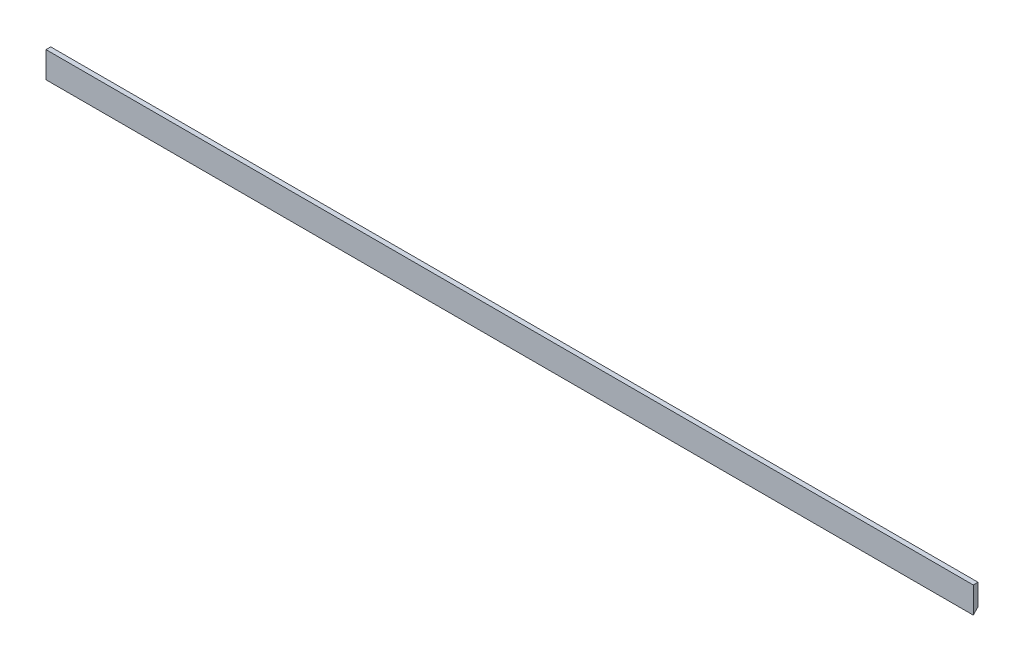
ISO-10303-21;
HEADER;
FILE_DESCRIPTION(('STEP AP214'),'2;1');
FILE_NAME('part.step','',(''),(''),'','','');
FILE_SCHEMA(('AUTOMOTIVE_DESIGN { 1 0 10303 214 1 1 1 1 }'));
ENDSEC;
DATA;
#1=APPLICATION_CONTEXT('core data for automotive mechanical design processes');
#2=APPLICATION_PROTOCOL_DEFINITION('international standard','automotive_design',2000,#1);
#3=PRODUCT_CONTEXT('',#1,'mechanical');
#4=PRODUCT('Part','Part','',(#3));
#5=PRODUCT_RELATED_PRODUCT_CATEGORY('part','',(#4));
#6=PRODUCT_DEFINITION_FORMATION('','',#4);
#7=PRODUCT_DEFINITION_CONTEXT('part definition',#1,'design');
#8=PRODUCT_DEFINITION('design','',#6,#7);
#9=PRODUCT_DEFINITION_SHAPE('','',#8);
#10=(LENGTH_UNIT() NAMED_UNIT(*) SI_UNIT(.MILLI.,.METRE.));
#11=(NAMED_UNIT(*) PLANE_ANGLE_UNIT() SI_UNIT($,.RADIAN.));
#12=(NAMED_UNIT(*) SI_UNIT($,.STERADIAN.) SOLID_ANGLE_UNIT());
#13=UNCERTAINTY_MEASURE_WITH_UNIT(LENGTH_MEASURE(1.E-05),#10,'distance_accuracy_value','');
#14=(GEOMETRIC_REPRESENTATION_CONTEXT(3) GLOBAL_UNCERTAINTY_ASSIGNED_CONTEXT((#13)) GLOBAL_UNIT_ASSIGNED_CONTEXT((#10,
#11,#12)) REPRESENTATION_CONTEXT('',''));
#15=CARTESIAN_POINT('',(0.,0.,0.));
#16=DIRECTION('',(0.,0.,1.));
#17=DIRECTION('',(1.,0.,0.));
#18=AXIS2_PLACEMENT_3D('',#15,#16,#17);
#19=CARTESIAN_POINT('',(310.5,8.75,-1.5875));
#20=DIRECTION('',(0.,0.,1.));
#21=DIRECTION('',(0.,-1.,0.));
#22=AXIS2_PLACEMENT_3D('',#19,#20,#21);
#23=PLANE('',#22);
#24=DIRECTION('',(0.,1.,0.));
#25=VECTOR('',#24,1.);
#26=CARTESIAN_POINT('',(310.5,8.75,-1.5875));
#27=LINE('',#26,#25);
#28=CARTESIAN_POINT('',(310.5,-5.57499999999996,-1.5875));
#29=VERTEX_POINT('',#28);
#30=CARTESIAN_POINT('',(310.5,8.75,-1.5875));
#31=VERTEX_POINT('',#30);
#32=EDGE_CURVE('E76',#29,#31,#27,.T.);
#33=ORIENTED_EDGE('',*,*,#32,.F.);
#34=DIRECTION('',(-1.,0.,0.));
#35=VECTOR('',#34,1.);
#36=CARTESIAN_POINT('',(310.5,-5.57499999999996,-1.5875));
#37=LINE('',#36,#35);
#38=CARTESIAN_POINT('',(-310.5,-5.57499999999996,-1.5875));
#39=VERTEX_POINT('',#38);
#40=EDGE_CURVE('E97',#29,#39,#37,.T.);
#41=ORIENTED_EDGE('',*,*,#40,.T.);
#42=DIRECTION('',(0.,1.,0.));
#43=VECTOR('',#42,1.);
#44=CARTESIAN_POINT('',(-310.5,8.75,-1.5875));
#45=LINE('',#44,#43);
#46=CARTESIAN_POINT('',(-310.5,8.75,-1.5875));
#47=VERTEX_POINT('',#46);
#48=EDGE_CURVE('E100',#39,#47,#45,.T.);
#49=ORIENTED_EDGE('',*,*,#48,.T.);
#50=DIRECTION('',(-1.,0.,0.));
#51=VECTOR('',#50,1.);
#52=CARTESIAN_POINT('',(310.5,8.75,-1.5875));
#53=LINE('',#52,#51);
#54=EDGE_CURVE('E89',#31,#47,#53,.T.);
#55=ORIENTED_EDGE('',*,*,#54,.F.);
#56=EDGE_LOOP('',(#33,#41,#49,#55));
#57=FACE_BOUND('',#56,.T.);
#58=ADVANCED_FACE('F41',(#57),#23,.F.);
#59=CARTESIAN_POINT('',(310.5,8.75,1.5875));
#60=DIRECTION('',(0.,-1.,0.));
#61=DIRECTION('',(0.,0.,-1.));
#62=AXIS2_PLACEMENT_3D('',#59,#60,#61);
#63=PLANE('',#62);
#64=DIRECTION('',(0.,0.,1.));
#65=VECTOR('',#64,1.);
#66=CARTESIAN_POINT('',(-310.5,8.75,1.5875));
#67=LINE('',#66,#65);
#68=CARTESIAN_POINT('',(-310.5,8.75,1.5875));
#69=VERTEX_POINT('',#68);
#70=EDGE_CURVE('E115',#47,#69,#67,.T.);
#71=ORIENTED_EDGE('',*,*,#70,.T.);
#72=DIRECTION('',(-1.,0.,0.));
#73=VECTOR('',#72,1.);
#74=CARTESIAN_POINT('',(310.5,8.75,1.5875));
#75=LINE('',#74,#73);
#76=CARTESIAN_POINT('',(310.5,8.75,1.5875));
#77=VERTEX_POINT('',#76);
#78=EDGE_CURVE('E95',#77,#69,#75,.T.);
#79=ORIENTED_EDGE('',*,*,#78,.F.);
#80=DIRECTION('',(0.,0.,1.));
#81=VECTOR('',#80,1.);
#82=CARTESIAN_POINT('',(310.5,8.75,1.5875));
#83=LINE('',#82,#81);
#84=EDGE_CURVE('E82',#31,#77,#83,.T.);
#85=ORIENTED_EDGE('',*,*,#84,.F.);
#86=ORIENTED_EDGE('',*,*,#54,.T.);
#87=EDGE_LOOP('',(#71,#79,#85,#86));
#88=FACE_BOUND('',#87,.T.);
#89=ADVANCED_FACE('F90',(#88),#63,.F.);
#90=CARTESIAN_POINT('',(310.5,8.75,1.5875));
#91=DIRECTION('',(0.,0.,-1.));
#92=DIRECTION('',(0.,1.,0.));
#93=AXIS2_PLACEMENT_3D('',#90,#91,#92);
#94=PLANE('',#93);
#95=DIRECTION('',(0.,-1.,0.));
#96=VECTOR('',#95,1.);
#97=CARTESIAN_POINT('',(-310.5,8.75,1.5875));
#98=LINE('',#97,#96);
#99=CARTESIAN_POINT('',(-310.5,-8.75,1.5875));
#100=VERTEX_POINT('',#99);
#101=EDGE_CURVE('E81',#69,#100,#98,.T.);
#102=ORIENTED_EDGE('',*,*,#101,.T.);
#103=DIRECTION('',(-1.,0.,0.));
#104=VECTOR('',#103,1.);
#105=CARTESIAN_POINT('',(310.5,-8.75,1.5875));
#106=LINE('',#105,#104);
#107=CARTESIAN_POINT('',(310.5,-8.75,1.5875));
#108=VERTEX_POINT('',#107);
#109=EDGE_CURVE('E105',#108,#100,#106,.T.);
#110=ORIENTED_EDGE('',*,*,#109,.F.);
#111=DIRECTION('',(0.,-1.,0.));
#112=VECTOR('',#111,1.);
#113=CARTESIAN_POINT('',(310.5,8.75,1.5875));
#114=LINE('',#113,#112);
#115=EDGE_CURVE('E94',#77,#108,#114,.T.);
#116=ORIENTED_EDGE('',*,*,#115,.F.);
#117=ORIENTED_EDGE('',*,*,#78,.T.);
#118=EDGE_LOOP('',(#102,#110,#116,#117));
#119=FACE_BOUND('',#118,.T.);
#120=ADVANCED_FACE('F112',(#119),#94,.F.);
#121=CARTESIAN_POINT('',(310.5,0.,0.));
#122=DIRECTION('',(1.,0.,0.));
#123=DIRECTION('',(0.,0.,-1.));
#124=AXIS2_PLACEMENT_3D('',#121,#122,#123);
#125=PLANE('',#124);
#126=ORIENTED_EDGE('',*,*,#115,.T.);
#127=DIRECTION('',(0.,-0.707106781186548,0.707106781186548));
#128=VECTOR('',#127,1.);
#129=CARTESIAN_POINT('',(310.5,-3.58124999999998,-3.58124999999998));
#130=LINE('',#129,#128);
#131=EDGE_CURVE('E11',#108,#29,#130,.F.);
#132=ORIENTED_EDGE('',*,*,#131,.T.);
#133=ORIENTED_EDGE('',*,*,#32,.T.);
#134=ORIENTED_EDGE('',*,*,#84,.T.);
#135=EDGE_LOOP('',(#126,#132,#133,#134));
#136=FACE_BOUND('',#135,.T.);
#137=ADVANCED_FACE('F79',(#136),#125,.T.);
#138=CARTESIAN_POINT('',(-310.5,0.,0.));
#139=DIRECTION('',(1.,0.,0.));
#140=DIRECTION('',(0.,0.,-1.));
#141=AXIS2_PLACEMENT_3D('',#138,#139,#140);
#142=PLANE('',#141);
#143=ORIENTED_EDGE('',*,*,#48,.F.);
#144=DIRECTION('',(0.,0.707106781186548,-0.707106781186548));
#145=VECTOR('',#144,1.);
#146=CARTESIAN_POINT('',(-310.5,-5.57499999999996,-1.5875));
#147=LINE('',#146,#145);
#148=EDGE_CURVE('E49',#39,#100,#147,.F.);
#149=ORIENTED_EDGE('',*,*,#148,.T.);
#150=ORIENTED_EDGE('',*,*,#101,.F.);
#151=ORIENTED_EDGE('',*,*,#70,.F.);
#152=EDGE_LOOP('',(#143,#149,#150,#151));
#153=FACE_BOUND('',#152,.T.);
#154=ADVANCED_FACE('F107',(#153),#142,.F.);
#155=CARTESIAN_POINT('',(310.5,-5.57499999999996,-1.5875));
#156=DIRECTION('',(0.,0.707106781186548,0.707106781186548));
#157=DIRECTION('',(-1.,0.,0.));
#158=AXIS2_PLACEMENT_3D('',#155,#156,#157);
#159=PLANE('',#158);
#160=ORIENTED_EDGE('',*,*,#131,.F.);
#161=ORIENTED_EDGE('',*,*,#109,.T.);
#162=ORIENTED_EDGE('',*,*,#148,.F.);
#163=ORIENTED_EDGE('',*,*,#40,.F.);
#164=EDGE_LOOP('',(#160,#161,#162,#163));
#165=FACE_BOUND('',#164,.T.);
#166=ADVANCED_FACE('F42',(#165),#159,.F.);
#167=CLOSED_SHELL('',(#58,#89,#120,#137,#154,#166));
#168=MANIFOLD_SOLID_BREP('B2',#167);
#169=ADVANCED_BREP_SHAPE_REPRESENTATION('',(#18,#168),#14);
#170=SHAPE_DEFINITION_REPRESENTATION(#9,#169);
ENDSEC;
END-ISO-10303-21;
